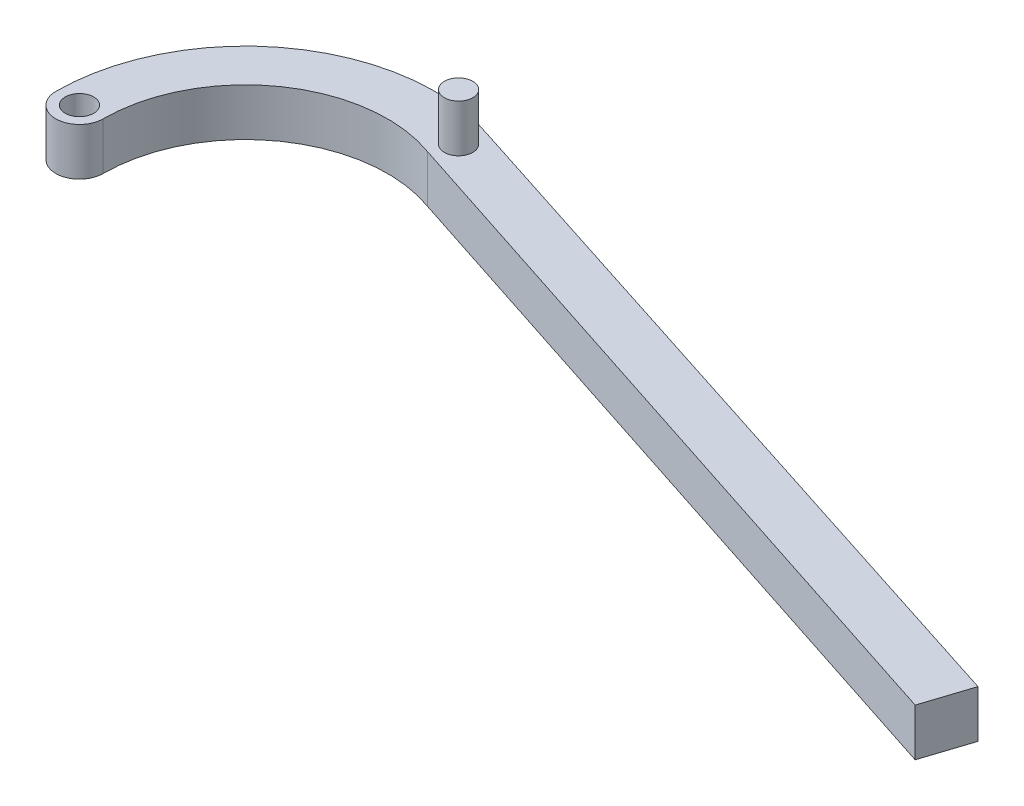
ISO-10303-21;
HEADER;
FILE_DESCRIPTION(('STEP AP214'),'2;1');
FILE_NAME('part.step','',(''),(''),'','','');
FILE_SCHEMA(('AUTOMOTIVE_DESIGN { 1 0 10303 214 1 1 1 1 }'));
ENDSEC;
DATA;
#1=APPLICATION_CONTEXT('core data for automotive mechanical design processes');
#2=APPLICATION_PROTOCOL_DEFINITION('international standard','automotive_design',2000,#1);
#3=PRODUCT_CONTEXT('',#1,'mechanical');
#4=PRODUCT('Part','Part','',(#3));
#5=PRODUCT_RELATED_PRODUCT_CATEGORY('part','',(#4));
#6=PRODUCT_DEFINITION_FORMATION('','',#4);
#7=PRODUCT_DEFINITION_CONTEXT('part definition',#1,'design');
#8=PRODUCT_DEFINITION('design','',#6,#7);
#9=PRODUCT_DEFINITION_SHAPE('','',#8);
#10=(LENGTH_UNIT() NAMED_UNIT(*) SI_UNIT(.MILLI.,.METRE.));
#11=(NAMED_UNIT(*) PLANE_ANGLE_UNIT() SI_UNIT($,.RADIAN.));
#12=(NAMED_UNIT(*) SI_UNIT($,.STERADIAN.) SOLID_ANGLE_UNIT());
#13=UNCERTAINTY_MEASURE_WITH_UNIT(LENGTH_MEASURE(1.E-05),#10,'distance_accuracy_value','');
#14=(GEOMETRIC_REPRESENTATION_CONTEXT(3) GLOBAL_UNCERTAINTY_ASSIGNED_CONTEXT((#13)) GLOBAL_UNIT_ASSIGNED_CONTEXT((#10,
#11,#12)) REPRESENTATION_CONTEXT('',''));
#15=CARTESIAN_POINT('',(0.,0.,0.));
#16=DIRECTION('',(0.,0.,1.));
#17=DIRECTION('',(1.,0.,0.));
#18=AXIS2_PLACEMENT_3D('',#15,#16,#17);
#19=CARTESIAN_POINT('',(0.,5.,0.));
#20=DIRECTION('',(0.,1.,0.));
#21=DIRECTION('',(0.,0.,1.));
#22=AXIS2_PLACEMENT_3D('',#19,#20,#21);
#23=PLANE('',#22);
#24=CARTESIAN_POINT('',(0.,5.,0.));
#25=DIRECTION('',(0.,1.,0.));
#26=DIRECTION('',(0.,0.,1.));
#27=AXIS2_PLACEMENT_3D('',#24,#25,#26);
#28=CIRCLE('',#27,20.);
#29=CARTESIAN_POINT('',(6.84040286651345,5.,-18.7938524157181));
#30=VERTEX_POINT('',#29);
#31=CARTESIAN_POINT('',(-20.,5.,0.));
#32=VERTEX_POINT('',#31);
#33=EDGE_CURVE('E83',#30,#32,#28,.T.);
#34=ORIENTED_EDGE('',*,*,#33,.T.);
#35=CARTESIAN_POINT('',(-17.5,5.,0.));
#36=DIRECTION('',(0.,1.,0.));
#37=DIRECTION('',(0.,0.,1.));
#38=AXIS2_PLACEMENT_3D('',#35,#36,#37);
#39=CIRCLE('',#38,2.5);
#40=CARTESIAN_POINT('',(-15.,5.,0.));
#41=VERTEX_POINT('',#40);
#42=EDGE_CURVE('E87',#32,#41,#39,.T.);
#43=ORIENTED_EDGE('',*,*,#42,.T.);
#44=CARTESIAN_POINT('',(0.,5.,0.));
#45=DIRECTION('',(0.,1.,0.));
#46=DIRECTION('',(0.,0.,1.));
#47=AXIS2_PLACEMENT_3D('',#44,#45,#46);
#48=CIRCLE('',#47,15.);
#49=CARTESIAN_POINT('',(5.13030214988509,5.,-14.0953893117886));
#50=VERTEX_POINT('',#49);
#51=EDGE_CURVE('E132',#50,#41,#48,.T.);
#52=ORIENTED_EDGE('',*,*,#51,.F.);
#53=DIRECTION('',(0.950847318404352,0.,0.309660099275405));
#54=VECTOR('',#53,1.);
#55=CARTESIAN_POINT('',(5.13030214988509,5.,-14.0953893117886));
#56=LINE('',#55,#54);
#57=CARTESIAN_POINT('',(81.3603887745927,5.,10.7302748459362));
#58=VERTEX_POINT('',#57);
#59=EDGE_CURVE('E108',#50,#58,#56,.T.);
#60=ORIENTED_EDGE('',*,*,#59,.T.);
#61=DIRECTION('',(0.309660099275406,0.,-0.950847318404351));
#62=VECTOR('',#61,1.);
#63=CARTESIAN_POINT('',(81.3603887745927,5.,10.7302748459362));
#64=LINE('',#63,#62);
#65=CARTESIAN_POINT('',(82.9887264334455,5.,5.73027484593621));
#66=VERTEX_POINT('',#65);
#67=EDGE_CURVE('E127',#58,#66,#64,.T.);
#68=ORIENTED_EDGE('',*,*,#67,.T.);
#69=DIRECTION('',(-0.951854044586651,0.,-0.306551590770679));
#70=VECTOR('',#69,1.);
#71=CARTESIAN_POINT('',(82.9887264334455,5.,5.73027484593621));
#72=LINE('',#71,#70);
#73=EDGE_CURVE('E90',#66,#30,#72,.T.);
#74=ORIENTED_EDGE('',*,*,#73,.T.);
#75=EDGE_LOOP('',(#34,#43,#52,#60,#68,#74));
#76=FACE_BOUND('',#75,.T.);
#77=CARTESIAN_POINT('',(-17.5,5.,0.));
#78=DIRECTION('',(0.,1.,0.));
#79=DIRECTION('',(0.,0.,1.));
#80=AXIS2_PLACEMENT_3D('',#77,#78,#79);
#81=CIRCLE('',#80,1.5);
#82=CARTESIAN_POINT('',(-17.5,5.,1.5));
#83=VERTEX_POINT('',#82);
#84=EDGE_CURVE('E111',#83,#83,#81,.T.);
#85=ORIENTED_EDGE('',*,*,#84,.F.);
#86=EDGE_LOOP('',(#85));
#87=FACE_BOUND('',#86,.T.);
#88=CARTESIAN_POINT('',(6.06584199155512,5.,-16.416852344646));
#89=DIRECTION('',(0.,1.,0.));
#90=DIRECTION('',(0.,0.,1.));
#91=AXIS2_PLACEMENT_3D('',#88,#89,#90);
#92=CIRCLE('',#91,1.5);
#93=CARTESIAN_POINT('',(6.06584199155512,5.,-14.916852344646));
#94=VERTEX_POINT('',#93);
#95=EDGE_CURVE('E180',#94,#94,#92,.T.);
#96=ORIENTED_EDGE('',*,*,#95,.F.);
#97=EDGE_LOOP('',(#96));
#98=FACE_BOUND('',#97,.T.);
#99=ADVANCED_FACE('F33',(#76,#87,#98),#23,.T.);
#100=CARTESIAN_POINT('',(0.,5.,0.));
#101=DIRECTION('',(0.,-1.,0.));
#102=DIRECTION('',(0.,0.,-1.));
#103=AXIS2_PLACEMENT_3D('',#100,#101,#102);
#104=CYLINDRICAL_SURFACE('',#103,20.);
#105=CARTESIAN_POINT('',(0.,0.,0.));
#106=DIRECTION('',(0.,1.,0.));
#107=DIRECTION('',(0.,0.,1.));
#108=AXIS2_PLACEMENT_3D('',#105,#106,#107);
#109=CIRCLE('',#108,20.);
#110=CARTESIAN_POINT('',(6.84040286651345,0.,-18.7938524157181));
#111=VERTEX_POINT('',#110);
#112=CARTESIAN_POINT('',(-20.,0.,0.));
#113=VERTEX_POINT('',#112);
#114=EDGE_CURVE('E93',#111,#113,#109,.T.);
#115=ORIENTED_EDGE('',*,*,#114,.T.);
#116=DIRECTION('',(0.,1.,0.));
#117=VECTOR('',#116,1.);
#118=CARTESIAN_POINT('',(-20.,0.,0.));
#119=LINE('',#118,#117);
#120=EDGE_CURVE('E96',#113,#32,#119,.T.);
#121=ORIENTED_EDGE('',*,*,#120,.T.);
#122=ORIENTED_EDGE('',*,*,#33,.F.);
#123=DIRECTION('',(0.,1.,0.));
#124=VECTOR('',#123,1.);
#125=CARTESIAN_POINT('',(6.84040286651345,0.,-18.7938524157181));
#126=LINE('',#125,#124);
#127=EDGE_CURVE('E101',#111,#30,#126,.T.);
#128=ORIENTED_EDGE('',*,*,#127,.F.);
#129=EDGE_LOOP('',(#115,#121,#122,#128));
#130=FACE_BOUND('',#129,.T.);
#131=ADVANCED_FACE('F35',(#130),#104,.T.);
#132=CARTESIAN_POINT('',(0.,0.,0.));
#133=DIRECTION('',(0.,1.,0.));
#134=DIRECTION('',(0.,0.,1.));
#135=AXIS2_PLACEMENT_3D('',#132,#133,#134);
#136=PLANE('',#135);
#137=CARTESIAN_POINT('',(-17.5,0.,0.));
#138=DIRECTION('',(0.,1.,0.));
#139=DIRECTION('',(0.,0.,1.));
#140=AXIS2_PLACEMENT_3D('',#137,#138,#139);
#141=CIRCLE('',#140,1.5);
#142=CARTESIAN_POINT('',(-17.5,0.,1.5));
#143=VERTEX_POINT('',#142);
#144=EDGE_CURVE('E106',#143,#143,#141,.T.);
#145=ORIENTED_EDGE('',*,*,#144,.T.);
#146=EDGE_LOOP('',(#145));
#147=FACE_BOUND('',#146,.T.);
#148=CARTESIAN_POINT('',(0.,0.,0.));
#149=DIRECTION('',(0.,1.,0.));
#150=DIRECTION('',(0.,0.,1.));
#151=AXIS2_PLACEMENT_3D('',#148,#149,#150);
#152=CIRCLE('',#151,15.);
#153=CARTESIAN_POINT('',(5.13030214988509,0.,-14.0953893117886));
#154=VERTEX_POINT('',#153);
#155=CARTESIAN_POINT('',(-15.,0.,0.));
#156=VERTEX_POINT('',#155);
#157=EDGE_CURVE('E50',#154,#156,#152,.T.);
#158=ORIENTED_EDGE('',*,*,#157,.T.);
#159=CARTESIAN_POINT('',(-17.5,0.,0.));
#160=DIRECTION('',(0.,1.,0.));
#161=DIRECTION('',(0.,0.,1.));
#162=AXIS2_PLACEMENT_3D('',#159,#160,#161);
#163=CIRCLE('',#162,2.5);
#164=EDGE_CURVE('E105',#113,#156,#163,.T.);
#165=ORIENTED_EDGE('',*,*,#164,.F.);
#166=ORIENTED_EDGE('',*,*,#114,.F.);
#167=DIRECTION('',(-0.951854044586651,0.,-0.306551590770679));
#168=VECTOR('',#167,1.);
#169=CARTESIAN_POINT('',(82.9887264334455,0.,5.73027484593621));
#170=LINE('',#169,#168);
#171=CARTESIAN_POINT('',(82.9887264334455,0.,5.73027484593621));
#172=VERTEX_POINT('',#171);
#173=EDGE_CURVE('E121',#172,#111,#170,.T.);
#174=ORIENTED_EDGE('',*,*,#173,.F.);
#175=DIRECTION('',(0.309660099275406,0.,-0.950847318404351));
#176=VECTOR('',#175,1.);
#177=CARTESIAN_POINT('',(81.3603887745927,0.,10.7302748459362));
#178=LINE('',#177,#176);
#179=CARTESIAN_POINT('',(81.3603887745927,0.,10.7302748459362));
#180=VERTEX_POINT('',#179);
#181=EDGE_CURVE('E118',#180,#172,#178,.T.);
#182=ORIENTED_EDGE('',*,*,#181,.F.);
#183=DIRECTION('',(0.950847318404352,0.,0.309660099275405));
#184=VECTOR('',#183,1.);
#185=CARTESIAN_POINT('',(5.13030214988509,0.,-14.0953893117886));
#186=LINE('',#185,#184);
#187=EDGE_CURVE('E115',#154,#180,#186,.T.);
#188=ORIENTED_EDGE('',*,*,#187,.F.);
#189=EDGE_LOOP('',(#158,#165,#166,#174,#182,#188));
#190=FACE_BOUND('',#189,.T.);
#191=ADVANCED_FACE('F147',(#147,#190),#136,.F.);
#192=CARTESIAN_POINT('',(0.,0.,0.));
#193=DIRECTION('',(0.,1.,0.));
#194=DIRECTION('',(0.,0.,1.));
#195=AXIS2_PLACEMENT_3D('',#192,#193,#194);
#196=CYLINDRICAL_SURFACE('',#195,15.);
#197=ORIENTED_EDGE('',*,*,#51,.T.);
#198=DIRECTION('',(0.,1.,0.));
#199=VECTOR('',#198,1.);
#200=CARTESIAN_POINT('',(-15.,0.,0.));
#201=LINE('',#200,#199);
#202=EDGE_CURVE('E11',#41,#156,#201,.F.);
#203=ORIENTED_EDGE('',*,*,#202,.T.);
#204=ORIENTED_EDGE('',*,*,#157,.F.);
#205=DIRECTION('',(0.,1.,0.));
#206=VECTOR('',#205,1.);
#207=CARTESIAN_POINT('',(5.13030214988509,0.,-14.0953893117886));
#208=LINE('',#207,#206);
#209=EDGE_CURVE('E41',#154,#50,#208,.T.);
#210=ORIENTED_EDGE('',*,*,#209,.T.);
#211=EDGE_LOOP('',(#197,#203,#204,#210));
#212=FACE_BOUND('',#211,.T.);
#213=ADVANCED_FACE('F137',(#212),#196,.F.);
#214=CARTESIAN_POINT('',(82.9887264334455,0.,5.73027484593621));
#215=DIRECTION('',(0.306551590770679,0.,-0.951854044586651));
#216=DIRECTION('',(-0.951854044586651,0.,-0.306551590770679));
#217=AXIS2_PLACEMENT_3D('',#214,#215,#216);
#218=PLANE('',#217);
#219=ORIENTED_EDGE('',*,*,#73,.F.);
#220=DIRECTION('',(0.,1.,0.));
#221=VECTOR('',#220,1.);
#222=CARTESIAN_POINT('',(82.9887264334455,0.,5.73027484593621));
#223=LINE('',#222,#221);
#224=EDGE_CURVE('E102',#172,#66,#223,.T.);
#225=ORIENTED_EDGE('',*,*,#224,.F.);
#226=ORIENTED_EDGE('',*,*,#173,.T.);
#227=ORIENTED_EDGE('',*,*,#127,.T.);
#228=EDGE_LOOP('',(#219,#225,#226,#227));
#229=FACE_BOUND('',#228,.T.);
#230=ADVANCED_FACE('F144',(#229),#218,.T.);
#231=CARTESIAN_POINT('',(81.3603887745927,0.,10.7302748459362));
#232=DIRECTION('',(0.950847318404351,0.,0.309660099275406));
#233=DIRECTION('',(0.309660099275406,0.,-0.950847318404351));
#234=AXIS2_PLACEMENT_3D('',#231,#232,#233);
#235=PLANE('',#234);
#236=ORIENTED_EDGE('',*,*,#67,.F.);
#237=DIRECTION('',(0.,1.,0.));
#238=VECTOR('',#237,1.);
#239=CARTESIAN_POINT('',(81.3603887745927,0.,10.7302748459362));
#240=LINE('',#239,#238);
#241=EDGE_CURVE('E124',#180,#58,#240,.T.);
#242=ORIENTED_EDGE('',*,*,#241,.F.);
#243=ORIENTED_EDGE('',*,*,#181,.T.);
#244=ORIENTED_EDGE('',*,*,#224,.T.);
#245=EDGE_LOOP('',(#236,#242,#243,#244));
#246=FACE_BOUND('',#245,.T.);
#247=ADVANCED_FACE('F149',(#246),#235,.T.);
#248=CARTESIAN_POINT('',(5.13030214988509,0.,-14.0953893117886));
#249=DIRECTION('',(-0.309660099275405,0.,0.950847318404352));
#250=DIRECTION('',(0.950847318404352,0.,0.309660099275405));
#251=AXIS2_PLACEMENT_3D('',#248,#249,#250);
#252=PLANE('',#251);
#253=ORIENTED_EDGE('',*,*,#59,.F.);
#254=ORIENTED_EDGE('',*,*,#209,.F.);
#255=ORIENTED_EDGE('',*,*,#187,.T.);
#256=ORIENTED_EDGE('',*,*,#241,.T.);
#257=EDGE_LOOP('',(#253,#254,#255,#256));
#258=FACE_BOUND('',#257,.T.);
#259=ADVANCED_FACE('F140',(#258),#252,.T.);
#260=CARTESIAN_POINT('',(-17.5,0.,0.));
#261=DIRECTION('',(0.,1.,0.));
#262=DIRECTION('',(0.,0.,1.));
#263=AXIS2_PLACEMENT_3D('',#260,#261,#262);
#264=CYLINDRICAL_SURFACE('',#263,2.5);
#265=ORIENTED_EDGE('',*,*,#42,.F.);
#266=ORIENTED_EDGE('',*,*,#120,.F.);
#267=ORIENTED_EDGE('',*,*,#164,.T.);
#268=ORIENTED_EDGE('',*,*,#202,.F.);
#269=EDGE_LOOP('',(#265,#266,#267,#268));
#270=FACE_BOUND('',#269,.T.);
#271=ADVANCED_FACE('F104',(#270),#264,.T.);
#272=CARTESIAN_POINT('',(-17.5,0.,0.));
#273=DIRECTION('',(0.,1.,0.));
#274=DIRECTION('',(0.,0.,1.));
#275=AXIS2_PLACEMENT_3D('',#272,#273,#274);
#276=CYLINDRICAL_SURFACE('',#275,1.5);
#277=ORIENTED_EDGE('',*,*,#144,.F.);
#278=EDGE_LOOP('',(#277));
#279=FACE_BOUND('',#278,.T.);
#280=ORIENTED_EDGE('',*,*,#84,.T.);
#281=EDGE_LOOP('',(#280));
#282=FACE_BOUND('',#281,.T.);
#283=ADVANCED_FACE('F171',(#279,#282),#276,.F.);
#284=CARTESIAN_POINT('',(6.06584199155512,10.,-16.416852344646));
#285=DIRECTION('',(0.,-1.,0.));
#286=DIRECTION('',(0.,0.,-1.));
#287=AXIS2_PLACEMENT_3D('',#284,#285,#286);
#288=CYLINDRICAL_SURFACE('',#287,1.5);
#289=CARTESIAN_POINT('',(6.06584199155512,10.,-16.416852344646));
#290=DIRECTION('',(0.,1.,0.));
#291=DIRECTION('',(0.,0.,1.));
#292=AXIS2_PLACEMENT_3D('',#289,#290,#291);
#293=CIRCLE('',#292,1.5);
#294=CARTESIAN_POINT('',(6.06584199155512,10.,-14.916852344646));
#295=VERTEX_POINT('',#294);
#296=EDGE_CURVE('E178',#295,#295,#293,.T.);
#297=ORIENTED_EDGE('',*,*,#296,.F.);
#298=EDGE_LOOP('',(#297));
#299=FACE_BOUND('',#298,.T.);
#300=ORIENTED_EDGE('',*,*,#95,.T.);
#301=EDGE_LOOP('',(#300));
#302=FACE_BOUND('',#301,.T.);
#303=ADVANCED_FACE('F174',(#299,#302),#288,.T.);
#304=CARTESIAN_POINT('',(6.06584199155512,10.,-16.416852344646));
#305=DIRECTION('',(0.,1.,0.));
#306=DIRECTION('',(0.,0.,1.));
#307=AXIS2_PLACEMENT_3D('',#304,#305,#306);
#308=PLANE('',#307);
#309=ORIENTED_EDGE('',*,*,#296,.T.);
#310=EDGE_LOOP('',(#309));
#311=FACE_BOUND('',#310,.T.);
#312=ADVANCED_FACE('F188',(#311),#308,.T.);
#313=CLOSED_SHELL('',(#99,#131,#191,#213,#230,#247,#259,#271,#283,#303,#312));
#314=MANIFOLD_SOLID_BREP('B2',#313);
#315=ADVANCED_BREP_SHAPE_REPRESENTATION('',(#18,#314),#14);
#316=SHAPE_DEFINITION_REPRESENTATION(#9,#315);
ENDSEC;
END-ISO-10303-21;
